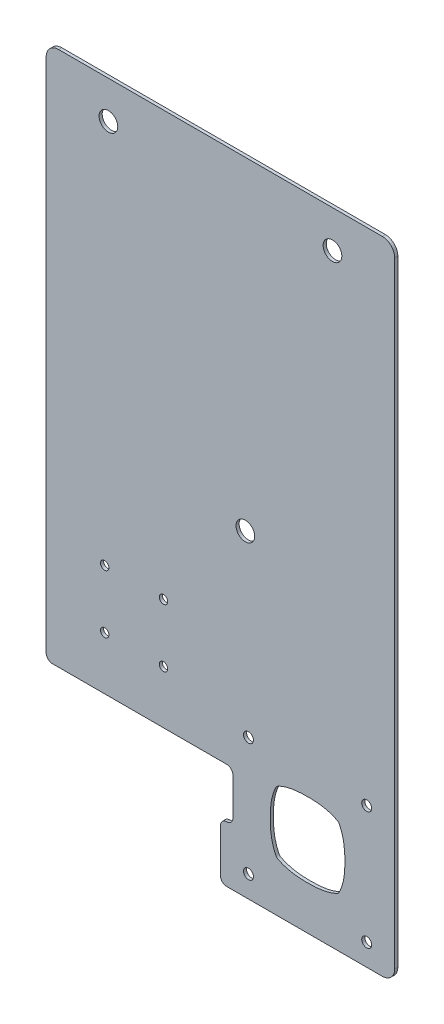
ISO-10303-21;
HEADER;
FILE_DESCRIPTION(('STEP AP214'),'2;1');
FILE_NAME('part.step','',(''),(''),'','','');
FILE_SCHEMA(('AUTOMOTIVE_DESIGN { 1 0 10303 214 1 1 1 1 }'));
ENDSEC;
DATA;
#1=APPLICATION_CONTEXT('core data for automotive mechanical design processes');
#2=APPLICATION_PROTOCOL_DEFINITION('international standard','automotive_design',2000,#1);
#3=PRODUCT_CONTEXT('',#1,'mechanical');
#4=PRODUCT('Part','Part','',(#3));
#5=PRODUCT_RELATED_PRODUCT_CATEGORY('part','',(#4));
#6=PRODUCT_DEFINITION_FORMATION('','',#4);
#7=PRODUCT_DEFINITION_CONTEXT('part definition',#1,'design');
#8=PRODUCT_DEFINITION('design','',#6,#7);
#9=PRODUCT_DEFINITION_SHAPE('','',#8);
#10=(LENGTH_UNIT() NAMED_UNIT(*) SI_UNIT(.MILLI.,.METRE.));
#11=(NAMED_UNIT(*) PLANE_ANGLE_UNIT() SI_UNIT($,.RADIAN.));
#12=(NAMED_UNIT(*) SI_UNIT($,.STERADIAN.) SOLID_ANGLE_UNIT());
#13=UNCERTAINTY_MEASURE_WITH_UNIT(LENGTH_MEASURE(1.E-05),#10,'distance_accuracy_value','');
#14=(GEOMETRIC_REPRESENTATION_CONTEXT(3) GLOBAL_UNCERTAINTY_ASSIGNED_CONTEXT((#13)) GLOBAL_UNIT_ASSIGNED_CONTEXT((#10,
#11,#12)) REPRESENTATION_CONTEXT('',''));
#15=CARTESIAN_POINT('',(0.,0.,0.));
#16=DIRECTION('',(0.,0.,1.));
#17=DIRECTION('',(1.,0.,0.));
#18=AXIS2_PLACEMENT_3D('',#15,#16,#17);
#19=CARTESIAN_POINT('',(-88.9,-225.309097921967,3.17500000000001));
#20=DIRECTION('',(-1.,0.,0.));
#21=DIRECTION('',(0.,1.,0.));
#22=AXIS2_PLACEMENT_3D('',#19,#20,#21);
#23=PLANE('',#22);
#24=DIRECTION('',(0.,1.,0.));
#25=VECTOR('',#24,1.);
#26=CARTESIAN_POINT('',(-88.9,-225.309097921967,3.17500000000001));
#27=LINE('',#26,#25);
#28=CARTESIAN_POINT('',(-88.9,-168.159097921967,3.175));
#29=VERTEX_POINT('',#28);
#30=CARTESIAN_POINT('',(-88.9,95.25,3.175));
#31=VERTEX_POINT('',#30);
#32=EDGE_CURVE('E269',#29,#31,#27,.T.);
#33=ORIENTED_EDGE('',*,*,#32,.T.);
#34=DIRECTION('',(0.,0.,1.));
#35=VECTOR('',#34,1.);
#36=CARTESIAN_POINT('',(-88.9,95.25,3.175));
#37=LINE('',#36,#35);
#38=CARTESIAN_POINT('',(-88.9,95.25,1.5875));
#39=VERTEX_POINT('',#38);
#40=EDGE_CURVE('E337',#39,#31,#37,.T.);
#41=ORIENTED_EDGE('',*,*,#40,.F.);
#42=DIRECTION('',(0.,1.,0.));
#43=VECTOR('',#42,1.);
#44=CARTESIAN_POINT('',(-88.9,-225.309097921967,1.58750000000001));
#45=LINE('',#44,#43);
#46=CARTESIAN_POINT('',(-88.9,-168.159097921967,1.58749999999999));
#47=VERTEX_POINT('',#46);
#48=EDGE_CURVE('E110',#47,#39,#45,.T.);
#49=ORIENTED_EDGE('',*,*,#48,.F.);
#50=DIRECTION('',(0.,0.,1.));
#51=VECTOR('',#50,1.);
#52=CARTESIAN_POINT('',(-88.9,-168.159097921967,3.175));
#53=LINE('',#52,#51);
#54=EDGE_CURVE('E12',#47,#29,#53,.T.);
#55=ORIENTED_EDGE('',*,*,#54,.T.);
#56=EDGE_LOOP('',(#33,#41,#49,#55));
#57=FACE_BOUND('',#56,.T.);
#58=ADVANCED_FACE('F41',(#57),#23,.T.);
#59=CARTESIAN_POINT('',(-85.725,-168.159097921967,3.175));
#60=DIRECTION('',(0.,0.,-1.));
#61=DIRECTION('',(0.,1.,0.));
#62=AXIS2_PLACEMENT_3D('',#59,#60,#61);
#63=CYLINDRICAL_SURFACE('',#62,3.175);
#64=ORIENTED_EDGE('',*,*,#54,.F.);
#65=CARTESIAN_POINT('',(-85.725,-168.159097921967,1.58749999999999));
#66=DIRECTION('',(0.,0.,-1.));
#67=DIRECTION('',(0.,1.,0.));
#68=AXIS2_PLACEMENT_3D('',#65,#66,#67);
#69=CIRCLE('',#68,3.175);
#70=CARTESIAN_POINT('',(-85.725,-171.334097921967,1.58749999999999));
#71=VERTEX_POINT('',#70);
#72=EDGE_CURVE('E213',#47,#71,#69,.F.);
#73=ORIENTED_EDGE('',*,*,#72,.T.);
#74=DIRECTION('',(0.,0.,1.));
#75=VECTOR('',#74,1.);
#76=CARTESIAN_POINT('',(-85.725,-171.334097921967,3.175));
#77=LINE('',#76,#75);
#78=CARTESIAN_POINT('',(-85.725,-171.334097921967,3.175));
#79=VERTEX_POINT('',#78);
#80=EDGE_CURVE('E50',#71,#79,#77,.T.);
#81=ORIENTED_EDGE('',*,*,#80,.T.);
#82=CARTESIAN_POINT('',(-85.725,-168.159097921967,3.175));
#83=DIRECTION('',(0.,0.,-1.));
#84=DIRECTION('',(0.,1.,0.));
#85=AXIS2_PLACEMENT_3D('',#82,#83,#84);
#86=CIRCLE('',#85,3.175);
#87=EDGE_CURVE('E263',#29,#79,#86,.F.);
#88=ORIENTED_EDGE('',*,*,#87,.F.);
#89=EDGE_LOOP('',(#64,#73,#81,#88));
#90=FACE_BOUND('',#89,.T.);
#91=ADVANCED_FACE('F262',(#90),#63,.T.);
#92=CARTESIAN_POINT('',(-88.9,-171.334097921967,3.175));
#93=DIRECTION('',(0.,1.,0.));
#94=DIRECTION('',(1.,0.,0.));
#95=AXIS2_PLACEMENT_3D('',#92,#93,#94);
#96=PLANE('',#95);
#97=ORIENTED_EDGE('',*,*,#80,.F.);
#98=DIRECTION('',(1.,0.,0.));
#99=VECTOR('',#98,1.);
#100=CARTESIAN_POINT('',(-88.9,-171.334097921967,1.58749999999999));
#101=LINE('',#100,#99);
#102=CARTESIAN_POINT('',(3.175,-171.334097921967,1.58749999999999));
#103=VERTEX_POINT('',#102);
#104=EDGE_CURVE('E211',#71,#103,#101,.T.);
#105=ORIENTED_EDGE('',*,*,#104,.T.);
#106=DIRECTION('',(0.,0.,1.));
#107=VECTOR('',#106,1.);
#108=CARTESIAN_POINT('',(3.175,-171.334097921967,3.175));
#109=LINE('',#108,#107);
#110=CARTESIAN_POINT('',(3.175,-171.334097921967,3.175));
#111=VERTEX_POINT('',#110);
#112=EDGE_CURVE('E260',#103,#111,#109,.T.);
#113=ORIENTED_EDGE('',*,*,#112,.T.);
#114=DIRECTION('',(1.,0.,0.));
#115=VECTOR('',#114,1.);
#116=CARTESIAN_POINT('',(-88.9,-171.334097921967,3.175));
#117=LINE('',#116,#115);
#118=EDGE_CURVE('E266',#79,#111,#117,.T.);
#119=ORIENTED_EDGE('',*,*,#118,.F.);
#120=EDGE_LOOP('',(#97,#105,#113,#119));
#121=FACE_BOUND('',#120,.T.);
#122=ADVANCED_FACE('F271',(#121),#96,.F.);
#123=CARTESIAN_POINT('',(3.17499999999999,-174.509097921967,3.175));
#124=DIRECTION('',(0.,0.,-1.));
#125=DIRECTION('',(0.,1.,0.));
#126=AXIS2_PLACEMENT_3D('',#123,#124,#125);
#127=CYLINDRICAL_SURFACE('',#126,3.175);
#128=ORIENTED_EDGE('',*,*,#112,.F.);
#129=CARTESIAN_POINT('',(3.17499999999999,-174.509097921967,1.58749999999999));
#130=DIRECTION('',(0.,0.,-1.));
#131=DIRECTION('',(0.,1.,0.));
#132=AXIS2_PLACEMENT_3D('',#129,#130,#131);
#133=CIRCLE('',#132,3.175);
#134=CARTESIAN_POINT('',(6.34999999999999,-174.509097921967,1.58749999999999));
#135=VERTEX_POINT('',#134);
#136=EDGE_CURVE('E208',#103,#135,#133,.T.);
#137=ORIENTED_EDGE('',*,*,#136,.T.);
#138=DIRECTION('',(0.,0.,1.));
#139=VECTOR('',#138,1.);
#140=CARTESIAN_POINT('',(6.35,-174.509097921967,3.175));
#141=LINE('',#140,#139);
#142=CARTESIAN_POINT('',(6.35,-174.509097921967,3.175));
#143=VERTEX_POINT('',#142);
#144=EDGE_CURVE('E258',#135,#143,#141,.T.);
#145=ORIENTED_EDGE('',*,*,#144,.T.);
#146=CARTESIAN_POINT('',(3.17499999999999,-174.509097921967,3.175));
#147=DIRECTION('',(0.,0.,-1.));
#148=DIRECTION('',(0.,1.,0.));
#149=AXIS2_PLACEMENT_3D('',#146,#147,#148);
#150=CIRCLE('',#149,3.175);
#151=EDGE_CURVE('E272',#111,#143,#150,.T.);
#152=ORIENTED_EDGE('',*,*,#151,.F.);
#153=EDGE_LOOP('',(#128,#137,#145,#152));
#154=FACE_BOUND('',#153,.T.);
#155=ADVANCED_FACE('F457',(#154),#127,.F.);
#156=CARTESIAN_POINT('',(6.35000000000001,-225.309097921967,3.17500000000001));
#157=DIRECTION('',(1.,0.,0.));
#158=DIRECTION('',(0.,-1.,0.));
#159=AXIS2_PLACEMENT_3D('',#156,#157,#158);
#160=PLANE('',#159);
#161=ORIENTED_EDGE('',*,*,#144,.F.);
#162=DIRECTION('',(0.,1.,0.));
#163=VECTOR('',#162,1.);
#164=CARTESIAN_POINT('',(6.34999999999999,-225.309097921967,1.58750000000001));
#165=LINE('',#164,#163);
#166=CARTESIAN_POINT('',(6.35000000000001,-193.559097921967,1.58749999999999));
#167=VERTEX_POINT('',#166);
#168=EDGE_CURVE('E205',#135,#167,#165,.F.);
#169=ORIENTED_EDGE('',*,*,#168,.T.);
#170=DIRECTION('',(0.,0.,1.));
#171=VECTOR('',#170,1.);
#172=CARTESIAN_POINT('',(6.35,-193.559097921967,3.175));
#173=LINE('',#172,#171);
#174=CARTESIAN_POINT('',(6.35,-193.559097921967,3.175));
#175=VERTEX_POINT('',#174);
#176=EDGE_CURVE('E256',#167,#175,#173,.T.);
#177=ORIENTED_EDGE('',*,*,#176,.T.);
#178=DIRECTION('',(0.,-1.,0.));
#179=VECTOR('',#178,1.);
#180=CARTESIAN_POINT('',(6.35000000000001,-225.309097921967,3.17500000000001));
#181=LINE('',#180,#179);
#182=EDGE_CURVE('E274',#143,#175,#181,.T.);
#183=ORIENTED_EDGE('',*,*,#182,.F.);
#184=EDGE_LOOP('',(#161,#169,#177,#183));
#185=FACE_BOUND('',#184,.T.);
#186=ADVANCED_FACE('F453',(#185),#160,.F.);
#187=CARTESIAN_POINT('',(3.175,-193.559097921967,3.175));
#188=DIRECTION('',(0.,0.,-1.));
#189=DIRECTION('',(0.,1.,0.));
#190=AXIS2_PLACEMENT_3D('',#187,#188,#189);
#191=CYLINDRICAL_SURFACE('',#190,3.175);
#192=ORIENTED_EDGE('',*,*,#176,.F.);
#193=CARTESIAN_POINT('',(3.175,-193.559097921967,1.58749999999999));
#194=DIRECTION('',(0.,0.,-1.));
#195=DIRECTION('',(0.,1.,0.));
#196=AXIS2_PLACEMENT_3D('',#193,#194,#195);
#197=CIRCLE('',#196,3.175);
#198=CARTESIAN_POINT('',(3.17499999999991,-196.734097921967,1.58749999999999));
#199=VERTEX_POINT('',#198);
#200=EDGE_CURVE('E202',#167,#199,#197,.T.);
#201=ORIENTED_EDGE('',*,*,#200,.T.);
#202=DIRECTION('',(0.,0.,1.));
#203=VECTOR('',#202,1.);
#204=CARTESIAN_POINT('',(3.17499999999991,-196.734097921967,3.175));
#205=LINE('',#204,#203);
#206=CARTESIAN_POINT('',(3.17499999999991,-196.734097921967,3.175));
#207=VERTEX_POINT('',#206);
#208=EDGE_CURVE('E254',#199,#207,#205,.T.);
#209=ORIENTED_EDGE('',*,*,#208,.T.);
#210=CARTESIAN_POINT('',(3.175,-193.559097921967,3.175));
#211=DIRECTION('',(0.,0.,-1.));
#212=DIRECTION('',(0.,1.,0.));
#213=AXIS2_PLACEMENT_3D('',#210,#211,#212);
#214=CIRCLE('',#213,3.175);
#215=EDGE_CURVE('E280',#175,#207,#214,.T.);
#216=ORIENTED_EDGE('',*,*,#215,.F.);
#217=EDGE_LOOP('',(#192,#201,#209,#216));
#218=FACE_BOUND('',#217,.T.);
#219=ADVANCED_FACE('F450',(#218),#191,.F.);
#220=CARTESIAN_POINT('',(3.17499999999992,-199.909097921967,3.175));
#221=DIRECTION('',(0.,0.,-1.));
#222=DIRECTION('',(0.,1.,0.));
#223=AXIS2_PLACEMENT_3D('',#220,#221,#222);
#224=CYLINDRICAL_SURFACE('',#223,3.175);
#225=ORIENTED_EDGE('',*,*,#208,.F.);
#226=CARTESIAN_POINT('',(3.17499999999992,-199.909097921967,1.58749999999999));
#227=DIRECTION('',(0.,0.,-1.));
#228=DIRECTION('',(0.,1.,0.));
#229=AXIS2_PLACEMENT_3D('',#226,#227,#228);
#230=CIRCLE('',#229,3.175);
#231=CARTESIAN_POINT('',(0.,-199.909097921967,1.58749999999999));
#232=VERTEX_POINT('',#231);
#233=EDGE_CURVE('E199',#199,#232,#230,.F.);
#234=ORIENTED_EDGE('',*,*,#233,.T.);
#235=DIRECTION('',(0.,0.,1.));
#236=VECTOR('',#235,1.);
#237=CARTESIAN_POINT('',(0.,-199.909097921967,3.175));
#238=LINE('',#237,#236);
#239=CARTESIAN_POINT('',(0.,-199.909097921967,3.175));
#240=VERTEX_POINT('',#239);
#241=EDGE_CURVE('E252',#232,#240,#238,.T.);
#242=ORIENTED_EDGE('',*,*,#241,.T.);
#243=CARTESIAN_POINT('',(3.17499999999992,-199.909097921967,3.175));
#244=DIRECTION('',(0.,0.,-1.));
#245=DIRECTION('',(0.,1.,0.));
#246=AXIS2_PLACEMENT_3D('',#243,#244,#245);
#247=CIRCLE('',#246,3.175);
#248=EDGE_CURVE('E283',#207,#240,#247,.F.);
#249=ORIENTED_EDGE('',*,*,#248,.F.);
#250=EDGE_LOOP('',(#225,#234,#242,#249));
#251=FACE_BOUND('',#250,.T.);
#252=ADVANCED_FACE('F447',(#251),#224,.T.);
#253=CARTESIAN_POINT('',(0.,-225.309097921967,3.17500000000001));
#254=DIRECTION('',(1.,0.,0.));
#255=DIRECTION('',(0.,-1.,0.));
#256=AXIS2_PLACEMENT_3D('',#253,#254,#255);
#257=PLANE('',#256);
#258=ORIENTED_EDGE('',*,*,#241,.F.);
#259=DIRECTION('',(0.,1.,0.));
#260=VECTOR('',#259,1.);
#261=CARTESIAN_POINT('',(0.,-225.309097921967,1.58750000000001));
#262=LINE('',#261,#260);
#263=CARTESIAN_POINT('',(0.,-222.134097921967,1.58750000000001));
#264=VERTEX_POINT('',#263);
#265=EDGE_CURVE('E196',#232,#264,#262,.F.);
#266=ORIENTED_EDGE('',*,*,#265,.T.);
#267=DIRECTION('',(0.,0.,1.));
#268=VECTOR('',#267,1.);
#269=CARTESIAN_POINT('',(0.,-222.134097921967,3.17500000000001));
#270=LINE('',#269,#268);
#271=CARTESIAN_POINT('',(0.,-222.134097921967,3.17500000000001));
#272=VERTEX_POINT('',#271);
#273=EDGE_CURVE('E167',#264,#272,#270,.T.);
#274=ORIENTED_EDGE('',*,*,#273,.T.);
#275=DIRECTION('',(0.,-1.,0.));
#276=VECTOR('',#275,1.);
#277=CARTESIAN_POINT('',(0.,-225.309097921967,3.17500000000001));
#278=LINE('',#277,#276);
#279=EDGE_CURVE('E178',#240,#272,#278,.T.);
#280=ORIENTED_EDGE('',*,*,#279,.F.);
#281=EDGE_LOOP('',(#258,#266,#274,#280));
#282=FACE_BOUND('',#281,.T.);
#283=ADVANCED_FACE('F288',(#282),#257,.F.);
#284=CARTESIAN_POINT('',(3.17499999999992,-222.134097921967,3.17500000000001));
#285=DIRECTION('',(0.,0.,-1.));
#286=DIRECTION('',(0.,1.,0.));
#287=AXIS2_PLACEMENT_3D('',#284,#285,#286);
#288=CYLINDRICAL_SURFACE('',#287,3.175);
#289=ORIENTED_EDGE('',*,*,#273,.F.);
#290=CARTESIAN_POINT('',(3.17499999999992,-222.134097921967,1.58750000000001));
#291=DIRECTION('',(0.,0.,-1.));
#292=DIRECTION('',(0.,1.,0.));
#293=AXIS2_PLACEMENT_3D('',#290,#291,#292);
#294=CIRCLE('',#293,3.175);
#295=CARTESIAN_POINT('',(3.17499999999991,-225.309097921967,1.58750000000001));
#296=VERTEX_POINT('',#295);
#297=EDGE_CURVE('E162',#264,#296,#294,.F.);
#298=ORIENTED_EDGE('',*,*,#297,.T.);
#299=DIRECTION('',(0.,0.,1.));
#300=VECTOR('',#299,1.);
#301=CARTESIAN_POINT('',(3.17499999999991,-225.309097921967,3.17500000000001));
#302=LINE('',#301,#300);
#303=CARTESIAN_POINT('',(3.17499999999991,-225.309097921967,3.17500000000001));
#304=VERTEX_POINT('',#303);
#305=EDGE_CURVE('E157',#296,#304,#302,.T.);
#306=ORIENTED_EDGE('',*,*,#305,.T.);
#307=CARTESIAN_POINT('',(3.17499999999992,-222.134097921967,3.17500000000001));
#308=DIRECTION('',(0.,0.,-1.));
#309=DIRECTION('',(0.,1.,0.));
#310=AXIS2_PLACEMENT_3D('',#307,#308,#309);
#311=CIRCLE('',#310,3.175);
#312=EDGE_CURVE('E160',#272,#304,#311,.F.);
#313=ORIENTED_EDGE('',*,*,#312,.F.);
#314=EDGE_LOOP('',(#289,#298,#306,#313));
#315=FACE_BOUND('',#314,.T.);
#316=ADVANCED_FACE('F159',(#315),#288,.T.);
#317=CARTESIAN_POINT('',(-88.9,-225.309097921967,3.17500000000001));
#318=DIRECTION('',(0.,-1.,0.));
#319=DIRECTION('',(-1.,0.,0.));
#320=AXIS2_PLACEMENT_3D('',#317,#318,#319);
#321=PLANE('',#320);
#322=ORIENTED_EDGE('',*,*,#305,.F.);
#323=DIRECTION('',(1.,0.,0.));
#324=VECTOR('',#323,1.);
#325=CARTESIAN_POINT('',(-88.9,-225.309097921967,1.58750000000001));
#326=LINE('',#325,#324);
#327=CARTESIAN_POINT('',(82.55,-225.309097921967,1.58750000000001));
#328=VERTEX_POINT('',#327);
#329=EDGE_CURVE('E193',#328,#296,#326,.F.);
#330=ORIENTED_EDGE('',*,*,#329,.F.);
#331=DIRECTION('',(0.,0.,1.));
#332=VECTOR('',#331,1.);
#333=CARTESIAN_POINT('',(82.55,-225.309097921967,3.17500000000001));
#334=LINE('',#333,#332);
#335=CARTESIAN_POINT('',(82.55,-225.309097921967,3.17500000000001));
#336=VERTEX_POINT('',#335);
#337=EDGE_CURVE('E168',#328,#336,#334,.T.);
#338=ORIENTED_EDGE('',*,*,#337,.T.);
#339=DIRECTION('',(-1.,0.,0.));
#340=VECTOR('',#339,1.);
#341=CARTESIAN_POINT('',(-88.9,-225.309097921967,3.17500000000001));
#342=LINE('',#341,#340);
#343=EDGE_CURVE('E175',#336,#304,#342,.T.);
#344=ORIENTED_EDGE('',*,*,#343,.T.);
#345=EDGE_LOOP('',(#322,#330,#338,#344));
#346=FACE_BOUND('',#345,.T.);
#347=ADVANCED_FACE('F180',(#346),#321,.T.);
#348=CARTESIAN_POINT('',(82.55,-218.959097921967,3.17500000000001));
#349=DIRECTION('',(0.,0.,-1.));
#350=DIRECTION('',(0.,1.,0.));
#351=AXIS2_PLACEMENT_3D('',#348,#349,#350);
#352=CYLINDRICAL_SURFACE('',#351,6.35);
#353=ORIENTED_EDGE('',*,*,#337,.F.);
#354=CARTESIAN_POINT('',(82.55,-218.959097921967,1.58750000000001));
#355=DIRECTION('',(0.,0.,-1.));
#356=DIRECTION('',(0.,1.,0.));
#357=AXIS2_PLACEMENT_3D('',#354,#355,#356);
#358=CIRCLE('',#357,6.35);
#359=CARTESIAN_POINT('',(88.9,-218.959097921967,1.58750000000001));
#360=VERTEX_POINT('',#359);
#361=EDGE_CURVE('E191',#328,#360,#358,.F.);
#362=ORIENTED_EDGE('',*,*,#361,.T.);
#363=DIRECTION('',(0.,0.,1.));
#364=VECTOR('',#363,1.);
#365=CARTESIAN_POINT('',(88.9,-218.959097921967,3.17500000000001));
#366=LINE('',#365,#364);
#367=CARTESIAN_POINT('',(88.9,-218.959097921967,3.17500000000001));
#368=VERTEX_POINT('',#367);
#369=EDGE_CURVE('E58',#360,#368,#366,.T.);
#370=ORIENTED_EDGE('',*,*,#369,.T.);
#371=CARTESIAN_POINT('',(82.55,-218.959097921967,3.17500000000001));
#372=DIRECTION('',(0.,0.,-1.));
#373=DIRECTION('',(0.,1.,0.));
#374=AXIS2_PLACEMENT_3D('',#371,#372,#373);
#375=CIRCLE('',#374,6.35);
#376=EDGE_CURVE('E181',#336,#368,#375,.F.);
#377=ORIENTED_EDGE('',*,*,#376,.F.);
#378=EDGE_LOOP('',(#353,#362,#370,#377));
#379=FACE_BOUND('',#378,.T.);
#380=ADVANCED_FACE('F296',(#379),#352,.T.);
#381=CARTESIAN_POINT('',(88.9,-225.309097921967,3.17500000000001));
#382=DIRECTION('',(-1.,0.,0.));
#383=DIRECTION('',(0.,1.,0.));
#384=AXIS2_PLACEMENT_3D('',#381,#382,#383);
#385=PLANE('',#384);
#386=ORIENTED_EDGE('',*,*,#369,.F.);
#387=DIRECTION('',(0.,1.,0.));
#388=VECTOR('',#387,1.);
#389=CARTESIAN_POINT('',(88.9,-225.309097921967,1.58750000000001));
#390=LINE('',#389,#388);
#391=CARTESIAN_POINT('',(88.9,95.25,1.5875));
#392=VERTEX_POINT('',#391);
#393=EDGE_CURVE('E188',#360,#392,#390,.T.);
#394=ORIENTED_EDGE('',*,*,#393,.T.);
#395=DIRECTION('',(0.,0.,1.));
#396=VECTOR('',#395,1.);
#397=CARTESIAN_POINT('',(88.9,95.25,3.175));
#398=LINE('',#397,#396);
#399=CARTESIAN_POINT('',(88.9,95.25,3.175));
#400=VERTEX_POINT('',#399);
#401=EDGE_CURVE('E303',#392,#400,#398,.T.);
#402=ORIENTED_EDGE('',*,*,#401,.T.);
#403=DIRECTION('',(0.,1.,0.));
#404=VECTOR('',#403,1.);
#405=CARTESIAN_POINT('',(88.9,-225.309097921967,3.17500000000001));
#406=LINE('',#405,#404);
#407=EDGE_CURVE('E183',#368,#400,#406,.T.);
#408=ORIENTED_EDGE('',*,*,#407,.F.);
#409=EDGE_LOOP('',(#386,#394,#402,#408));
#410=FACE_BOUND('',#409,.T.);
#411=ADVANCED_FACE('F301',(#410),#385,.F.);
#412=CARTESIAN_POINT('',(59.248488812379,-200.325102380171,3.175));
#413=CARTESIAN_POINT('',(59.5791310842276,-200.162642267825,3.175));
#414=CARTESIAN_POINT('',(60.235404786611,-199.819502708578,3.175));
#415=CARTESIAN_POINT('',(62.9698183631979,-194.589782982606,3.175));
#416=CARTESIAN_POINT('',(63.994688585421,-184.03409792183,3.175));
#417=CARTESIAN_POINT('',(62.9698183630822,-173.478412861106,3.175));
#418=CARTESIAN_POINT('',(60.2354047866109,-168.248693135356,3.175));
#419=CARTESIAN_POINT('',(55.0056850606331,-165.514279558769,3.175));
#420=CARTESIAN_POINT('',(44.4499999998614,-164.489409336395,3.175));
#421=CARTESIAN_POINT('',(33.8943149391428,-165.514279558885,3.175));
#422=CARTESIAN_POINT('',(28.6645952133889,-168.248693135356,3.175));
#423=CARTESIAN_POINT('',(25.930181636802,-173.478412861333,3.175));
#424=CARTESIAN_POINT('',(24.90531141446,-184.034097922105,3.175));
#425=CARTESIAN_POINT('',(25.9301816369179,-194.589782982825,3.175));
#426=CARTESIAN_POINT('',(28.664595213389,-199.819502708578,3.175));
#427=CARTESIAN_POINT('',(33.8943149393609,-202.553916285165,3.175));
#428=CARTESIAN_POINT('',(44.4500000001374,-203.578786507356,3.175));
#429=CARTESIAN_POINT('',(54.6401231934281,-202.589409336442,3.175));
#430=CARTESIAN_POINT('',(59.248488812379,-200.325102380171,3.175));
#431=B_SPLINE_CURVE_WITH_KNOTS('',3,(#412,#413,#414,#415,#416,#417,#418,#419,#420,#421,#422,
#423,#424,#425,#426,#427,#428,#429,#430),.UNSPECIFIED.,.T.,.F.,(4,1,1,1,1,1,1,1,1,1,1,1,1,1,1,1,
4),(0.,0.00836813483475174,0.0167362696695037,0.133368134837552,0.249999999999913,
0.258368134834665,0.266736269669416,0.383368134837594,0.500000000000047,0.508368134834801,
0.516736269669551,0.633368134837695,0.750000000000134,0.758368134834886,0.766736269669638,
0.883368134837663,1.),.UNSPECIFIED.);
#432=DIRECTION('',(0.,0.,-1.));
#433=VECTOR('',#432,1.);
#434=SURFACE_OF_LINEAR_EXTRUSION('',#431,#433);
#435=CARTESIAN_POINT('',(59.248488812379,-200.325102380171,3.175));
#436=VERTEX_POINT('',#435);
#437=EDGE_CURVE('E190',#436,#436,#431,.T.);
#438=ORIENTED_EDGE('',*,*,#437,.T.);
#439=EDGE_LOOP('',(#438));
#440=FACE_BOUND('',#439,.T.);
#441=CARTESIAN_POINT('',(59.248488812379,-200.325102380171,1.58749999999999));
#442=CARTESIAN_POINT('',(59.5791310842276,-200.162642267825,1.58749999999999));
#443=CARTESIAN_POINT('',(60.235404786611,-199.819502708578,1.58749999999999));
#444=CARTESIAN_POINT('',(62.9698183631979,-194.589782982606,1.58749999999999));
#445=CARTESIAN_POINT('',(63.994688585421,-184.03409792183,1.58749999999999));
#446=CARTESIAN_POINT('',(62.9698183630822,-173.478412861106,1.58749999999999));
#447=CARTESIAN_POINT('',(60.2354047866109,-168.248693135356,1.58749999999999));
#448=CARTESIAN_POINT('',(55.0056850606331,-165.514279558769,1.58749999999999));
#449=CARTESIAN_POINT('',(44.4499999998614,-164.489409336395,1.58749999999999));
#450=CARTESIAN_POINT('',(33.8943149391428,-165.514279558885,1.58749999999999));
#451=CARTESIAN_POINT('',(28.6645952133889,-168.248693135356,1.58749999999999));
#452=CARTESIAN_POINT('',(25.930181636802,-173.478412861333,1.58749999999999));
#453=CARTESIAN_POINT('',(24.90531141446,-184.034097922105,1.58749999999999));
#454=CARTESIAN_POINT('',(25.9301816369179,-194.589782982825,1.58749999999999));
#455=CARTESIAN_POINT('',(28.664595213389,-199.819502708578,1.58749999999999));
#456=CARTESIAN_POINT('',(33.8943149393609,-202.553916285165,1.58749999999999));
#457=CARTESIAN_POINT('',(44.4500000001374,-203.578786507356,1.58749999999999));
#458=CARTESIAN_POINT('',(54.6401231934281,-202.589409336442,1.58749999999999));
#459=CARTESIAN_POINT('',(59.248488812379,-200.325102380171,1.58749999999999));
#460=B_SPLINE_CURVE_WITH_KNOTS('',3,(#441,#442,#443,#444,#445,#446,#447,#448,#449,#450,#451,
#452,#453,#454,#455,#456,#457,#458,#459),.UNSPECIFIED.,.T.,.F.,(4,1,1,1,1,1,1,1,1,1,1,1,1,1,1,1,
4),(0.,0.00836813483475174,0.0167362696695037,0.133368134837552,0.249999999999913,
0.258368134834665,0.266736269669416,0.383368134837594,0.500000000000047,0.508368134834801,
0.516736269669551,0.633368134837695,0.750000000000134,0.758368134834886,0.766736269669638,
0.883368134837663,1.),.UNSPECIFIED.);
#461=CARTESIAN_POINT('',(59.248488812379,-200.325102380171,1.58749999999999));
#462=VERTEX_POINT('',#461);
#463=EDGE_CURVE('E217',#462,#462,#460,.T.);
#464=ORIENTED_EDGE('',*,*,#463,.F.);
#465=EDGE_LOOP('',(#464));
#466=FACE_BOUND('',#465,.T.);
#467=ADVANCED_FACE('F354',(#440,#466),#434,.T.);
#468=CARTESIAN_POINT('',(-29.05,-144.27413515056,3.175));
#469=DIRECTION('',(0.,0.,-1.));
#470=DIRECTION('',(0.,1.,0.));
#471=AXIS2_PLACEMENT_3D('',#468,#469,#470);
#472=CYLINDRICAL_SURFACE('',#471,2.14999999999998);
#473=CARTESIAN_POINT('',(-29.05,-144.27413515056,3.175));
#474=DIRECTION('',(0.,0.,1.));
#475=DIRECTION('',(0.,-1.,0.));
#476=AXIS2_PLACEMENT_3D('',#473,#474,#475);
#477=CIRCLE('',#476,2.14999999999998);
#478=CARTESIAN_POINT('',(-29.05,-146.42413515056,3.175));
#479=VERTEX_POINT('',#478);
#480=EDGE_CURVE('E348',#479,#479,#477,.T.);
#481=ORIENTED_EDGE('',*,*,#480,.T.);
#482=EDGE_LOOP('',(#481));
#483=FACE_BOUND('',#482,.T.);
#484=CARTESIAN_POINT('',(-29.05,-144.27413515056,1.58749999999999));
#485=DIRECTION('',(0.,0.,1.));
#486=DIRECTION('',(0.,-1.,0.));
#487=AXIS2_PLACEMENT_3D('',#484,#485,#486);
#488=CIRCLE('',#487,2.14999999999998);
#489=CARTESIAN_POINT('',(-29.05,-146.42413515056,1.58749999999999));
#490=VERTEX_POINT('',#489);
#491=EDGE_CURVE('E222',#490,#490,#488,.T.);
#492=ORIENTED_EDGE('',*,*,#491,.F.);
#493=EDGE_LOOP('',(#492));
#494=FACE_BOUND('',#493,.T.);
#495=ADVANCED_FACE('F358',(#483,#494),#472,.F.);
#496=CARTESIAN_POINT('',(74.6124999999998,-153.871597921967,3.175));
#497=DIRECTION('',(0.,0.,-1.));
#498=DIRECTION('',(0.,1.,0.));
#499=AXIS2_PLACEMENT_3D('',#496,#497,#498);
#500=CYLINDRICAL_SURFACE('',#499,2.54);
#501=CARTESIAN_POINT('',(74.6124999999998,-153.871597921967,3.175));
#502=DIRECTION('',(0.,0.,1.));
#503=DIRECTION('',(0.,-1.,0.));
#504=AXIS2_PLACEMENT_3D('',#501,#502,#503);
#505=CIRCLE('',#504,2.54);
#506=CARTESIAN_POINT('',(74.6124999999998,-156.411597921967,3.175));
#507=VERTEX_POINT('',#506);
#508=EDGE_CURVE('E874',#507,#507,#505,.T.);
#509=ORIENTED_EDGE('',*,*,#508,.T.);
#510=EDGE_LOOP('',(#509));
#511=FACE_BOUND('',#510,.T.);
#512=CARTESIAN_POINT('',(74.6124999999998,-153.871597921967,1.58749999999999));
#513=DIRECTION('',(0.,0.,1.));
#514=DIRECTION('',(0.,-1.,0.));
#515=AXIS2_PLACEMENT_3D('',#512,#513,#514);
#516=CIRCLE('',#515,2.54);
#517=CARTESIAN_POINT('',(74.6124999999998,-156.411597921967,1.58749999999999));
#518=VERTEX_POINT('',#517);
#519=EDGE_CURVE('E229',#518,#518,#516,.T.);
#520=ORIENTED_EDGE('',*,*,#519,.F.);
#521=EDGE_LOOP('',(#520));
#522=FACE_BOUND('',#521,.T.);
#523=ADVANCED_FACE('F363',(#511,#522),#500,.F.);
#524=CARTESIAN_POINT('',(14.2874999999998,-153.871597921967,3.175));
#525=DIRECTION('',(0.,0.,-1.));
#526=DIRECTION('',(0.,1.,0.));
#527=AXIS2_PLACEMENT_3D('',#524,#525,#526);
#528=CYLINDRICAL_SURFACE('',#527,2.54);
#529=CARTESIAN_POINT('',(14.2874999999998,-153.871597921967,3.175));
#530=DIRECTION('',(0.,0.,1.));
#531=DIRECTION('',(0.,-1.,0.));
#532=AXIS2_PLACEMENT_3D('',#529,#530,#531);
#533=CIRCLE('',#532,2.54);
#534=CARTESIAN_POINT('',(14.2874999999998,-156.411597921967,3.175));
#535=VERTEX_POINT('',#534);
#536=EDGE_CURVE('E872',#535,#535,#533,.T.);
#537=ORIENTED_EDGE('',*,*,#536,.T.);
#538=EDGE_LOOP('',(#537));
#539=FACE_BOUND('',#538,.T.);
#540=CARTESIAN_POINT('',(14.2874999999998,-153.871597921967,1.58749999999999));
#541=DIRECTION('',(0.,0.,1.));
#542=DIRECTION('',(0.,-1.,0.));
#543=AXIS2_PLACEMENT_3D('',#540,#541,#542);
#544=CIRCLE('',#543,2.54);
#545=CARTESIAN_POINT('',(14.2874999999998,-156.411597921967,1.58749999999999));
#546=VERTEX_POINT('',#545);
#547=EDGE_CURVE('E232',#546,#546,#544,.T.);
#548=ORIENTED_EDGE('',*,*,#547,.F.);
#549=EDGE_LOOP('',(#548));
#550=FACE_BOUND('',#549,.T.);
#551=ADVANCED_FACE('F367',(#539,#550),#528,.F.);
#552=CARTESIAN_POINT('',(14.2874999999998,-214.196597921967,3.17500000000001));
#553=DIRECTION('',(0.,0.,-1.));
#554=DIRECTION('',(0.,1.,0.));
#555=AXIS2_PLACEMENT_3D('',#552,#553,#554);
#556=CYLINDRICAL_SURFACE('',#555,2.54);
#557=CARTESIAN_POINT('',(14.2874999999998,-214.196597921967,3.17500000000001));
#558=DIRECTION('',(0.,0.,1.));
#559=DIRECTION('',(0.,-1.,0.));
#560=AXIS2_PLACEMENT_3D('',#557,#558,#559);
#561=CIRCLE('',#560,2.54);
#562=CARTESIAN_POINT('',(14.2874999999998,-216.736597921967,3.17500000000001));
#563=VERTEX_POINT('',#562);
#564=EDGE_CURVE('E869',#563,#563,#561,.T.);
#565=ORIENTED_EDGE('',*,*,#564,.T.);
#566=EDGE_LOOP('',(#565));
#567=FACE_BOUND('',#566,.T.);
#568=CARTESIAN_POINT('',(14.2874999999998,-214.196597921967,1.58750000000001));
#569=DIRECTION('',(0.,0.,1.));
#570=DIRECTION('',(0.,-1.,0.));
#571=AXIS2_PLACEMENT_3D('',#568,#569,#570);
#572=CIRCLE('',#571,2.54);
#573=CARTESIAN_POINT('',(14.2874999999998,-216.736597921967,1.58750000000001));
#574=VERTEX_POINT('',#573);
#575=EDGE_CURVE('E235',#574,#574,#572,.T.);
#576=ORIENTED_EDGE('',*,*,#575,.F.);
#577=EDGE_LOOP('',(#576));
#578=FACE_BOUND('',#577,.T.);
#579=ADVANCED_FACE('F371',(#567,#578),#556,.F.);
#580=CARTESIAN_POINT('',(-59.0499999999999,-114.57413515056,3.175));
#581=DIRECTION('',(0.,0.,-1.));
#582=DIRECTION('',(0.,1.,0.));
#583=AXIS2_PLACEMENT_3D('',#580,#581,#582);
#584=CYLINDRICAL_SURFACE('',#583,2.14999999999999);
#585=CARTESIAN_POINT('',(-59.0499999999999,-114.57413515056,3.175));
#586=DIRECTION('',(0.,0.,1.));
#587=DIRECTION('',(0.,-1.,0.));
#588=AXIS2_PLACEMENT_3D('',#585,#586,#587);
#589=CIRCLE('',#588,2.14999999999999);
#590=CARTESIAN_POINT('',(-59.0499999999999,-116.72413515056,3.175));
#591=VERTEX_POINT('',#590);
#592=EDGE_CURVE('E866',#591,#591,#589,.T.);
#593=ORIENTED_EDGE('',*,*,#592,.T.);
#594=EDGE_LOOP('',(#593));
#595=FACE_BOUND('',#594,.T.);
#596=CARTESIAN_POINT('',(-59.0499999999999,-114.57413515056,1.58749999999999));
#597=DIRECTION('',(0.,0.,1.));
#598=DIRECTION('',(0.,-1.,0.));
#599=AXIS2_PLACEMENT_3D('',#596,#597,#598);
#600=CIRCLE('',#599,2.14999999999999);
#601=CARTESIAN_POINT('',(-59.0499999999999,-116.72413515056,1.58749999999999));
#602=VERTEX_POINT('',#601);
#603=EDGE_CURVE('E238',#602,#602,#600,.T.);
#604=ORIENTED_EDGE('',*,*,#603,.F.);
#605=EDGE_LOOP('',(#604));
#606=FACE_BOUND('',#605,.T.);
#607=ADVANCED_FACE('F375',(#595,#606),#584,.F.);
#608=CARTESIAN_POINT('',(-29.05,-114.57413515056,3.175));
#609=DIRECTION('',(0.,0.,-1.));
#610=DIRECTION('',(0.,1.,0.));
#611=AXIS2_PLACEMENT_3D('',#608,#609,#610);
#612=CYLINDRICAL_SURFACE('',#611,2.14999999999999);
#613=CARTESIAN_POINT('',(-29.05,-114.57413515056,3.175));
#614=DIRECTION('',(0.,0.,1.));
#615=DIRECTION('',(0.,-1.,0.));
#616=AXIS2_PLACEMENT_3D('',#613,#614,#615);
#617=CIRCLE('',#616,2.14999999999999);
#618=CARTESIAN_POINT('',(-29.05,-116.72413515056,3.175));
#619=VERTEX_POINT('',#618);
#620=EDGE_CURVE('E863',#619,#619,#617,.T.);
#621=ORIENTED_EDGE('',*,*,#620,.T.);
#622=EDGE_LOOP('',(#621));
#623=FACE_BOUND('',#622,.T.);
#624=CARTESIAN_POINT('',(-29.05,-114.57413515056,1.58749999999999));
#625=DIRECTION('',(0.,0.,1.));
#626=DIRECTION('',(0.,-1.,0.));
#627=AXIS2_PLACEMENT_3D('',#624,#625,#626);
#628=CIRCLE('',#627,2.14999999999999);
#629=CARTESIAN_POINT('',(-29.05,-116.72413515056,1.58749999999999));
#630=VERTEX_POINT('',#629);
#631=EDGE_CURVE('E241',#630,#630,#628,.T.);
#632=ORIENTED_EDGE('',*,*,#631,.F.);
#633=EDGE_LOOP('',(#632));
#634=FACE_BOUND('',#633,.T.);
#635=ADVANCED_FACE('F379',(#623,#634),#612,.F.);
#636=CARTESIAN_POINT('',(-59.0499999999997,-144.27413515056,3.175));
#637=DIRECTION('',(0.,0.,-1.));
#638=DIRECTION('',(0.,1.,0.));
#639=AXIS2_PLACEMENT_3D('',#636,#637,#638);
#640=CYLINDRICAL_SURFACE('',#639,2.14999999999998);
#641=CARTESIAN_POINT('',(-59.0499999999997,-144.27413515056,3.175));
#642=DIRECTION('',(0.,0.,1.));
#643=DIRECTION('',(0.,-1.,0.));
#644=AXIS2_PLACEMENT_3D('',#641,#642,#643);
#645=CIRCLE('',#644,2.14999999999998);
#646=CARTESIAN_POINT('',(-59.0499999999997,-146.42413515056,3.175));
#647=VERTEX_POINT('',#646);
#648=EDGE_CURVE('E858',#647,#647,#645,.T.);
#649=ORIENTED_EDGE('',*,*,#648,.T.);
#650=EDGE_LOOP('',(#649));
#651=FACE_BOUND('',#650,.T.);
#652=CARTESIAN_POINT('',(-59.0499999999997,-144.27413515056,1.58749999999999));
#653=DIRECTION('',(0.,0.,1.));
#654=DIRECTION('',(0.,-1.,0.));
#655=AXIS2_PLACEMENT_3D('',#652,#653,#654);
#656=CIRCLE('',#655,2.14999999999998);
#657=CARTESIAN_POINT('',(-59.0499999999997,-146.42413515056,1.58749999999999));
#658=VERTEX_POINT('',#657);
#659=EDGE_CURVE('E244',#658,#658,#656,.T.);
#660=ORIENTED_EDGE('',*,*,#659,.F.);
#661=EDGE_LOOP('',(#660));
#662=FACE_BOUND('',#661,.T.);
#663=ADVANCED_FACE('F383',(#651,#662),#640,.F.);
#664=CARTESIAN_POINT('',(74.6124999999998,-214.196597921967,3.17500000000001));
#665=DIRECTION('',(0.,0.,-1.));
#666=DIRECTION('',(0.,1.,0.));
#667=AXIS2_PLACEMENT_3D('',#664,#665,#666);
#668=CYLINDRICAL_SURFACE('',#667,2.54000000000001);
#669=CARTESIAN_POINT('',(74.6124999999998,-214.196597921967,3.17500000000001));
#670=DIRECTION('',(0.,0.,1.));
#671=DIRECTION('',(0.,-1.,0.));
#672=AXIS2_PLACEMENT_3D('',#669,#670,#671);
#673=CIRCLE('',#672,2.54000000000001);
#674=CARTESIAN_POINT('',(74.6124999999998,-216.736597921967,3.17500000000001));
#675=VERTEX_POINT('',#674);
#676=EDGE_CURVE('E401',#675,#675,#673,.T.);
#677=ORIENTED_EDGE('',*,*,#676,.T.);
#678=EDGE_LOOP('',(#677));
#679=FACE_BOUND('',#678,.T.);
#680=CARTESIAN_POINT('',(74.6124999999998,-214.196597921967,1.58750000000001));
#681=DIRECTION('',(0.,0.,1.));
#682=DIRECTION('',(0.,-1.,0.));
#683=AXIS2_PLACEMENT_3D('',#680,#681,#682);
#684=CIRCLE('',#683,2.54000000000001);
#685=CARTESIAN_POINT('',(74.6124999999998,-216.736597921967,1.58750000000001));
#686=VERTEX_POINT('',#685);
#687=EDGE_CURVE('E216',#686,#686,#684,.T.);
#688=ORIENTED_EDGE('',*,*,#687,.F.);
#689=EDGE_LOOP('',(#688));
#690=FACE_BOUND('',#689,.T.);
#691=ADVANCED_FACE('F386',(#679,#690),#668,.F.);
#692=CARTESIAN_POINT('',(0.,0.,3.175));
#693=DIRECTION('',(0.,0.,-1.));
#694=DIRECTION('',(-1.,0.,0.));
#695=AXIS2_PLACEMENT_3D('',#692,#693,#694);
#696=PLANE('',#695);
#697=ORIENTED_EDGE('',*,*,#437,.F.);
#698=EDGE_LOOP('',(#697));
#699=FACE_BOUND('',#698,.T.);
#700=ORIENTED_EDGE('',*,*,#480,.F.);
#701=EDGE_LOOP('',(#700));
#702=FACE_BOUND('',#701,.T.);
#703=ORIENTED_EDGE('',*,*,#508,.F.);
#704=EDGE_LOOP('',(#703));
#705=FACE_BOUND('',#704,.T.);
#706=ORIENTED_EDGE('',*,*,#536,.F.);
#707=EDGE_LOOP('',(#706));
#708=FACE_BOUND('',#707,.T.);
#709=ORIENTED_EDGE('',*,*,#564,.F.);
#710=EDGE_LOOP('',(#709));
#711=FACE_BOUND('',#710,.T.);
#712=ORIENTED_EDGE('',*,*,#592,.F.);
#713=EDGE_LOOP('',(#712));
#714=FACE_BOUND('',#713,.T.);
#715=ORIENTED_EDGE('',*,*,#620,.F.);
#716=EDGE_LOOP('',(#715));
#717=FACE_BOUND('',#716,.T.);
#718=ORIENTED_EDGE('',*,*,#648,.F.);
#719=EDGE_LOOP('',(#718));
#720=FACE_BOUND('',#719,.T.);
#721=ORIENTED_EDGE('',*,*,#676,.F.);
#722=EDGE_LOOP('',(#721));
#723=FACE_BOUND('',#722,.T.);
#724=ORIENTED_EDGE('',*,*,#32,.F.);
#725=ORIENTED_EDGE('',*,*,#87,.T.);
#726=ORIENTED_EDGE('',*,*,#118,.T.);
#727=ORIENTED_EDGE('',*,*,#151,.T.);
#728=ORIENTED_EDGE('',*,*,#182,.T.);
#729=ORIENTED_EDGE('',*,*,#215,.T.);
#730=ORIENTED_EDGE('',*,*,#248,.T.);
#731=ORIENTED_EDGE('',*,*,#279,.T.);
#732=ORIENTED_EDGE('',*,*,#312,.T.);
#733=ORIENTED_EDGE('',*,*,#343,.F.);
#734=ORIENTED_EDGE('',*,*,#376,.T.);
#735=ORIENTED_EDGE('',*,*,#407,.T.);
#736=CARTESIAN_POINT('',(82.55,95.25,3.175));
#737=DIRECTION('',(0.,0.,-1.));
#738=DIRECTION('',(-1.,0.,0.));
#739=AXIS2_PLACEMENT_3D('',#736,#737,#738);
#740=CIRCLE('',#739,6.35);
#741=CARTESIAN_POINT('',(82.55,101.6,3.175));
#742=VERTEX_POINT('',#741);
#743=EDGE_CURVE('E310',#400,#742,#740,.F.);
#744=ORIENTED_EDGE('',*,*,#743,.T.);
#745=DIRECTION('',(-1.,0.,0.));
#746=VECTOR('',#745,1.);
#747=CARTESIAN_POINT('',(-88.9,101.6,3.175));
#748=LINE('',#747,#746);
#749=CARTESIAN_POINT('',(-82.55,101.6,3.175));
#750=VERTEX_POINT('',#749);
#751=EDGE_CURVE('E315',#742,#750,#748,.T.);
#752=ORIENTED_EDGE('',*,*,#751,.T.);
#753=CARTESIAN_POINT('',(-82.55,95.25,3.175));
#754=DIRECTION('',(0.,0.,-1.));
#755=DIRECTION('',(-1.,0.,0.));
#756=AXIS2_PLACEMENT_3D('',#753,#754,#755);
#757=CIRCLE('',#756,6.35);
#758=EDGE_CURVE('E308',#750,#31,#757,.F.);
#759=ORIENTED_EDGE('',*,*,#758,.T.);
#760=EDGE_LOOP('',(#724,#725,#726,#727,#728,#729,#730,#731,#732,#733,#734,#735,#744,#752,#759));
#761=FACE_BOUND('',#760,.T.);
#762=CARTESIAN_POINT('',(-57.15,82.55,3.175));
#763=DIRECTION('',(0.,0.,1.));
#764=DIRECTION('',(1.,0.,0.));
#765=AXIS2_PLACEMENT_3D('',#762,#763,#764);
#766=CIRCLE('',#765,4.7625);
#767=CARTESIAN_POINT('',(-52.3875,82.55,3.175));
#768=VERTEX_POINT('',#767);
#769=EDGE_CURVE('E316',#768,#768,#766,.T.);
#770=ORIENTED_EDGE('',*,*,#769,.F.);
#771=EDGE_LOOP('',(#770));
#772=FACE_BOUND('',#771,.T.);
#773=CARTESIAN_POINT('',(57.15,82.55,3.175));
#774=DIRECTION('',(0.,0.,1.));
#775=DIRECTION('',(1.,0.,0.));
#776=AXIS2_PLACEMENT_3D('',#773,#774,#775);
#777=CIRCLE('',#776,4.7625);
#778=CARTESIAN_POINT('',(61.9125,82.55,3.175));
#779=VERTEX_POINT('',#778);
#780=EDGE_CURVE('E320',#779,#779,#777,.T.);
#781=ORIENTED_EDGE('',*,*,#780,.F.);
#782=EDGE_LOOP('',(#781));
#783=FACE_BOUND('',#782,.T.);
#784=CARTESIAN_POINT('',(12.7,-63.5,3.175));
#785=DIRECTION('',(0.,0.,1.));
#786=DIRECTION('',(1.,0.,0.));
#787=AXIS2_PLACEMENT_3D('',#784,#785,#786);
#788=CIRCLE('',#787,4.76250000000001);
#789=CARTESIAN_POINT('',(17.4625,-63.5,3.175));
#790=VERTEX_POINT('',#789);
#791=EDGE_CURVE('E326',#790,#790,#788,.T.);
#792=ORIENTED_EDGE('',*,*,#791,.F.);
#793=EDGE_LOOP('',(#792));
#794=FACE_BOUND('',#793,.T.);
#795=ADVANCED_FACE('F43',(#699,#702,#705,#708,#711,#714,#717,#720,#723,#761,#772,#783,#794),
#696,.F.);
#796=CARTESIAN_POINT('',(-88.9,-225.309097921967,1.58750000000001));
#797=DIRECTION('',(0.,0.,-1.));
#798=DIRECTION('',(0.,1.,0.));
#799=AXIS2_PLACEMENT_3D('',#796,#797,#798);
#800=PLANE('',#799);
#801=ORIENTED_EDGE('',*,*,#463,.T.);
#802=EDGE_LOOP('',(#801));
#803=FACE_BOUND('',#802,.T.);
#804=ORIENTED_EDGE('',*,*,#491,.T.);
#805=EDGE_LOOP('',(#804));
#806=FACE_BOUND('',#805,.T.);
#807=ORIENTED_EDGE('',*,*,#519,.T.);
#808=EDGE_LOOP('',(#807));
#809=FACE_BOUND('',#808,.T.);
#810=ORIENTED_EDGE('',*,*,#547,.T.);
#811=EDGE_LOOP('',(#810));
#812=FACE_BOUND('',#811,.T.);
#813=ORIENTED_EDGE('',*,*,#575,.T.);
#814=EDGE_LOOP('',(#813));
#815=FACE_BOUND('',#814,.T.);
#816=ORIENTED_EDGE('',*,*,#603,.T.);
#817=EDGE_LOOP('',(#816));
#818=FACE_BOUND('',#817,.T.);
#819=ORIENTED_EDGE('',*,*,#631,.T.);
#820=EDGE_LOOP('',(#819));
#821=FACE_BOUND('',#820,.T.);
#822=ORIENTED_EDGE('',*,*,#659,.T.);
#823=EDGE_LOOP('',(#822));
#824=FACE_BOUND('',#823,.T.);
#825=ORIENTED_EDGE('',*,*,#687,.T.);
#826=EDGE_LOOP('',(#825));
#827=FACE_BOUND('',#826,.T.);
#828=ORIENTED_EDGE('',*,*,#48,.T.);
#829=CARTESIAN_POINT('',(-82.55,95.25,1.5875));
#830=DIRECTION('',(0.,0.,-1.));
#831=DIRECTION('',(-1.,0.,0.));
#832=AXIS2_PLACEMENT_3D('',#829,#830,#831);
#833=CIRCLE('',#832,6.35);
#834=CARTESIAN_POINT('',(-82.55,101.6,1.5875));
#835=VERTEX_POINT('',#834);
#836=EDGE_CURVE('E340',#835,#39,#833,.F.);
#837=ORIENTED_EDGE('',*,*,#836,.F.);
#838=DIRECTION('',(-1.,0.,0.));
#839=VECTOR('',#838,1.);
#840=CARTESIAN_POINT('',(0.,101.6,1.5875));
#841=LINE('',#840,#839);
#842=CARTESIAN_POINT('',(82.55,101.6,1.5875));
#843=VERTEX_POINT('',#842);
#844=EDGE_CURVE('E334',#843,#835,#841,.T.);
#845=ORIENTED_EDGE('',*,*,#844,.F.);
#846=CARTESIAN_POINT('',(82.55,95.25,1.5875));
#847=DIRECTION('',(0.,0.,-1.));
#848=DIRECTION('',(-1.,0.,0.));
#849=AXIS2_PLACEMENT_3D('',#846,#847,#848);
#850=CIRCLE('',#849,6.35);
#851=EDGE_CURVE('E330',#392,#843,#850,.F.);
#852=ORIENTED_EDGE('',*,*,#851,.F.);
#853=ORIENTED_EDGE('',*,*,#393,.F.);
#854=ORIENTED_EDGE('',*,*,#361,.F.);
#855=ORIENTED_EDGE('',*,*,#329,.T.);
#856=ORIENTED_EDGE('',*,*,#297,.F.);
#857=ORIENTED_EDGE('',*,*,#265,.F.);
#858=ORIENTED_EDGE('',*,*,#233,.F.);
#859=ORIENTED_EDGE('',*,*,#200,.F.);
#860=ORIENTED_EDGE('',*,*,#168,.F.);
#861=ORIENTED_EDGE('',*,*,#136,.F.);
#862=ORIENTED_EDGE('',*,*,#104,.F.);
#863=ORIENTED_EDGE('',*,*,#72,.F.);
#864=EDGE_LOOP('',(#828,#837,#845,#852,#853,#854,#855,#856,#857,#858,#859,#860,#861,#862,#863));
#865=FACE_BOUND('',#864,.T.);
#866=CARTESIAN_POINT('',(-57.15,82.55,1.5875));
#867=DIRECTION('',(0.,0.,1.));
#868=DIRECTION('',(1.,0.,0.));
#869=AXIS2_PLACEMENT_3D('',#866,#867,#868);
#870=CIRCLE('',#869,4.7625);
#871=CARTESIAN_POINT('',(-52.3875,82.55,1.5875));
#872=VERTEX_POINT('',#871);
#873=EDGE_CURVE('E307',#872,#872,#870,.T.);
#874=ORIENTED_EDGE('',*,*,#873,.T.);
#875=EDGE_LOOP('',(#874));
#876=FACE_BOUND('',#875,.T.);
#877=CARTESIAN_POINT('',(57.15,82.55,1.5875));
#878=DIRECTION('',(0.,0.,1.));
#879=DIRECTION('',(1.,0.,0.));
#880=AXIS2_PLACEMENT_3D('',#877,#878,#879);
#881=CIRCLE('',#880,4.7625);
#882=CARTESIAN_POINT('',(61.9125,82.55,1.5875));
#883=VERTEX_POINT('',#882);
#884=EDGE_CURVE('E408',#883,#883,#881,.T.);
#885=ORIENTED_EDGE('',*,*,#884,.T.);
#886=EDGE_LOOP('',(#885));
#887=FACE_BOUND('',#886,.T.);
#888=CARTESIAN_POINT('',(12.7,-63.5,1.5875));
#889=DIRECTION('',(0.,0.,1.));
#890=DIRECTION('',(1.,0.,0.));
#891=AXIS2_PLACEMENT_3D('',#888,#889,#890);
#892=CIRCLE('',#891,4.76250000000001);
#893=CARTESIAN_POINT('',(17.4625,-63.5,1.5875));
#894=VERTEX_POINT('',#893);
#895=EDGE_CURVE('E223',#894,#894,#892,.T.);
#896=ORIENTED_EDGE('',*,*,#895,.T.);
#897=EDGE_LOOP('',(#896));
#898=FACE_BOUND('',#897,.T.);
#899=ADVANCED_FACE('F290',(#803,#806,#809,#812,#815,#818,#821,#824,#827,#865,#876,#887,#898),
#800,.T.);
#900=CARTESIAN_POINT('',(-82.55,95.25,3.175));
#901=DIRECTION('',(0.,0.,-1.));
#902=DIRECTION('',(-1.,0.,0.));
#903=AXIS2_PLACEMENT_3D('',#900,#901,#902);
#904=CYLINDRICAL_SURFACE('',#903,6.35);
#905=DIRECTION('',(0.,0.,1.));
#906=VECTOR('',#905,1.);
#907=CARTESIAN_POINT('',(-82.55,101.6,3.175));
#908=LINE('',#907,#906);
#909=EDGE_CURVE('E332',#835,#750,#908,.T.);
#910=ORIENTED_EDGE('',*,*,#909,.F.);
#911=ORIENTED_EDGE('',*,*,#836,.T.);
#912=ORIENTED_EDGE('',*,*,#40,.T.);
#913=ORIENTED_EDGE('',*,*,#758,.F.);
#914=EDGE_LOOP('',(#910,#911,#912,#913));
#915=FACE_BOUND('',#914,.T.);
#916=ADVANCED_FACE('F404',(#915),#904,.T.);
#917=CARTESIAN_POINT('',(-88.9,101.6,3.175));
#918=DIRECTION('',(0.,-1.,0.));
#919=DIRECTION('',(-1.,0.,0.));
#920=AXIS2_PLACEMENT_3D('',#917,#918,#919);
#921=PLANE('',#920);
#922=DIRECTION('',(0.,0.,1.));
#923=VECTOR('',#922,1.);
#924=CARTESIAN_POINT('',(82.55,101.6,3.175));
#925=LINE('',#924,#923);
#926=EDGE_CURVE('E312',#843,#742,#925,.T.);
#927=ORIENTED_EDGE('',*,*,#926,.F.);
#928=ORIENTED_EDGE('',*,*,#844,.T.);
#929=ORIENTED_EDGE('',*,*,#909,.T.);
#930=ORIENTED_EDGE('',*,*,#751,.F.);
#931=EDGE_LOOP('',(#927,#928,#929,#930));
#932=FACE_BOUND('',#931,.T.);
#933=ADVANCED_FACE('F427',(#932),#921,.F.);
#934=CARTESIAN_POINT('',(82.55,95.25,3.175));
#935=DIRECTION('',(0.,0.,-1.));
#936=DIRECTION('',(-1.,0.,0.));
#937=AXIS2_PLACEMENT_3D('',#934,#935,#936);
#938=CYLINDRICAL_SURFACE('',#937,6.35);
#939=ORIENTED_EDGE('',*,*,#401,.F.);
#940=ORIENTED_EDGE('',*,*,#851,.T.);
#941=ORIENTED_EDGE('',*,*,#926,.T.);
#942=ORIENTED_EDGE('',*,*,#743,.F.);
#943=EDGE_LOOP('',(#939,#940,#941,#942));
#944=FACE_BOUND('',#943,.T.);
#945=ADVANCED_FACE('F311',(#944),#938,.T.);
#946=CARTESIAN_POINT('',(12.7,-63.5,3.175));
#947=DIRECTION('',(0.,0.,-1.));
#948=DIRECTION('',(-1.,0.,0.));
#949=AXIS2_PLACEMENT_3D('',#946,#947,#948);
#950=CYLINDRICAL_SURFACE('',#949,4.76250000000001);
#951=ORIENTED_EDGE('',*,*,#791,.T.);
#952=EDGE_LOOP('',(#951));
#953=FACE_BOUND('',#952,.T.);
#954=ORIENTED_EDGE('',*,*,#895,.F.);
#955=EDGE_LOOP('',(#954));
#956=FACE_BOUND('',#955,.T.);
#957=ADVANCED_FACE('F415',(#953,#956),#950,.F.);
#958=CARTESIAN_POINT('',(57.15,82.55,3.175));
#959=DIRECTION('',(0.,0.,-1.));
#960=DIRECTION('',(-1.,0.,0.));
#961=AXIS2_PLACEMENT_3D('',#958,#959,#960);
#962=CYLINDRICAL_SURFACE('',#961,4.7625);
#963=ORIENTED_EDGE('',*,*,#780,.T.);
#964=EDGE_LOOP('',(#963));
#965=FACE_BOUND('',#964,.T.);
#966=ORIENTED_EDGE('',*,*,#884,.F.);
#967=EDGE_LOOP('',(#966));
#968=FACE_BOUND('',#967,.T.);
#969=ADVANCED_FACE('F417',(#965,#968),#962,.F.);
#970=CARTESIAN_POINT('',(-57.15,82.55,3.175));
#971=DIRECTION('',(0.,0.,-1.));
#972=DIRECTION('',(-1.,0.,0.));
#973=AXIS2_PLACEMENT_3D('',#970,#971,#972);
#974=CYLINDRICAL_SURFACE('',#973,4.7625);
#975=ORIENTED_EDGE('',*,*,#769,.T.);
#976=EDGE_LOOP('',(#975));
#977=FACE_BOUND('',#976,.T.);
#978=ORIENTED_EDGE('',*,*,#873,.F.);
#979=EDGE_LOOP('',(#978));
#980=FACE_BOUND('',#979,.T.);
#981=ADVANCED_FACE('F424',(#977,#980),#974,.F.);
#982=CLOSED_SHELL('',(#58,#91,#122,#155,#186,#219,#252,#283,#316,#347,#380,#411,#467,#495,#523,
#551,#579,#607,#635,#663,#691,#795,#899,#916,#933,#945,#957,#969,#981));
#983=MANIFOLD_SOLID_BREP('B2',#982);
#984=ADVANCED_BREP_SHAPE_REPRESENTATION('',(#18,#983),#14);
#985=SHAPE_DEFINITION_REPRESENTATION(#9,#984);
ENDSEC;
END-ISO-10303-21;
